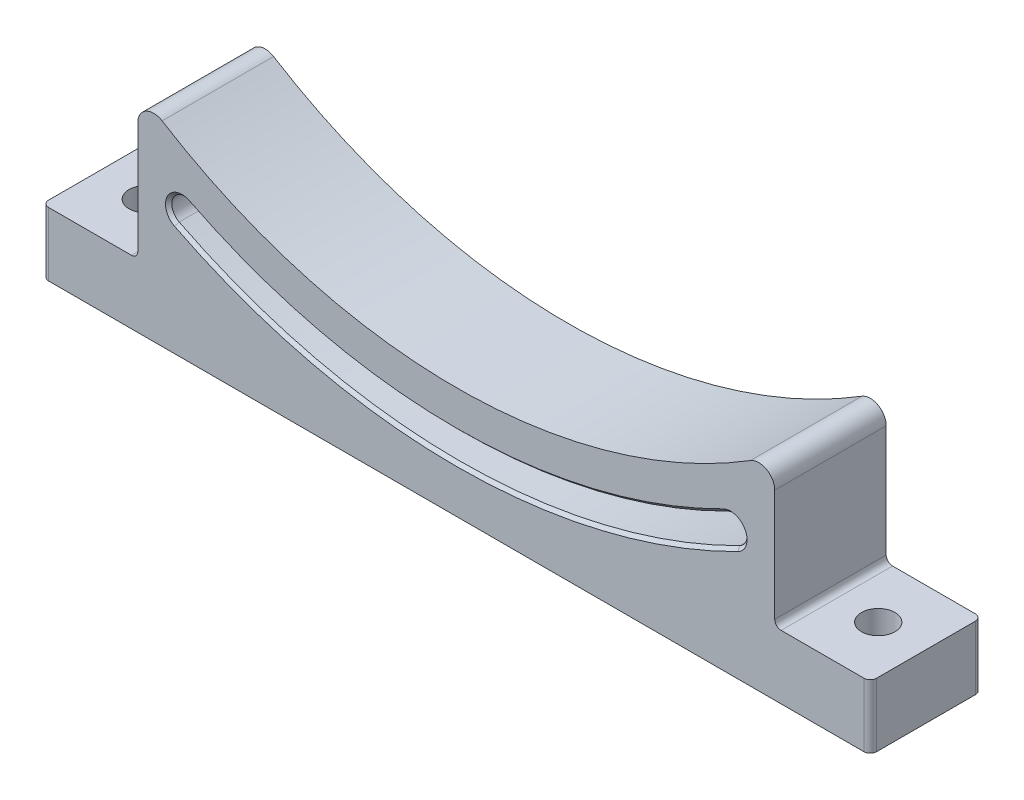
ISO-10303-21;
HEADER;
FILE_DESCRIPTION(('STEP AP214'),'2;1');
FILE_NAME('part.step','',(''),(''),'','','');
FILE_SCHEMA(('AUTOMOTIVE_DESIGN { 1 0 10303 214 1 1 1 1 }'));
ENDSEC;
DATA;
#1=APPLICATION_CONTEXT('core data for automotive mechanical design processes');
#2=APPLICATION_PROTOCOL_DEFINITION('international standard','automotive_design',2000,#1);
#3=PRODUCT_CONTEXT('',#1,'mechanical');
#4=PRODUCT('Part','Part','',(#3));
#5=PRODUCT_RELATED_PRODUCT_CATEGORY('part','',(#4));
#6=PRODUCT_DEFINITION_FORMATION('','',#4);
#7=PRODUCT_DEFINITION_CONTEXT('part definition',#1,'design');
#8=PRODUCT_DEFINITION('design','',#6,#7);
#9=PRODUCT_DEFINITION_SHAPE('','',#8);
#10=(LENGTH_UNIT() NAMED_UNIT(*) SI_UNIT(.MILLI.,.METRE.));
#11=(NAMED_UNIT(*) PLANE_ANGLE_UNIT() SI_UNIT($,.RADIAN.));
#12=(NAMED_UNIT(*) SI_UNIT($,.STERADIAN.) SOLID_ANGLE_UNIT());
#13=UNCERTAINTY_MEASURE_WITH_UNIT(LENGTH_MEASURE(1.E-05),#10,'distance_accuracy_value','');
#14=(GEOMETRIC_REPRESENTATION_CONTEXT(3) GLOBAL_UNCERTAINTY_ASSIGNED_CONTEXT((#13)) GLOBAL_UNIT_ASSIGNED_CONTEXT((#10,
#11,#12)) REPRESENTATION_CONTEXT('',''));
#15=CARTESIAN_POINT('',(0.,0.,0.));
#16=DIRECTION('',(0.,0.,1.));
#17=DIRECTION('',(1.,0.,0.));
#18=AXIS2_PLACEMENT_3D('',#15,#16,#17);
#19=CARTESIAN_POINT('',(-200.,0.,35.));
#20=DIRECTION('',(1.,0.,0.));
#21=DIRECTION('',(0.,0.,-1.));
#22=AXIS2_PLACEMENT_3D('',#19,#20,#21);
#23=PLANE('',#22);
#24=DIRECTION('',(0.,-1.,0.));
#25=VECTOR('',#24,1.);
#26=CARTESIAN_POINT('',(-200.,0.,0.));
#27=LINE('',#26,#25);
#28=CARTESIAN_POINT('',(-200.,57.1111514857934,0.));
#29=VERTEX_POINT('',#28);
#30=CARTESIAN_POINT('',(-200.,22.,0.));
#31=VERTEX_POINT('',#30);
#32=EDGE_CURVE('E227',#29,#31,#27,.T.);
#33=ORIENTED_EDGE('',*,*,#32,.T.);
#34=DIRECTION('',(0.,0.,-1.));
#35=VECTOR('',#34,1.);
#36=CARTESIAN_POINT('',(-200.,22.,35.));
#37=LINE('',#36,#35);
#38=CARTESIAN_POINT('',(-200.,22.,35.));
#39=VERTEX_POINT('',#38);
#40=EDGE_CURVE('E322',#31,#39,#37,.F.);
#41=ORIENTED_EDGE('',*,*,#40,.T.);
#42=DIRECTION('',(0.,-1.,0.));
#43=VECTOR('',#42,1.);
#44=CARTESIAN_POINT('',(-200.,0.,35.));
#45=LINE('',#44,#43);
#46=CARTESIAN_POINT('',(-200.,57.1111514857934,35.));
#47=VERTEX_POINT('',#46);
#48=EDGE_CURVE('E399',#47,#39,#45,.T.);
#49=ORIENTED_EDGE('',*,*,#48,.F.);
#50=DIRECTION('',(0.,0.,-1.));
#51=VECTOR('',#50,1.);
#52=CARTESIAN_POINT('',(-200.,57.1111514857934,35.));
#53=LINE('',#52,#51);
#54=EDGE_CURVE('E248',#47,#29,#53,.T.);
#55=ORIENTED_EDGE('',*,*,#54,.T.);
#56=EDGE_LOOP('',(#33,#41,#49,#55));
#57=FACE_BOUND('',#56,.T.);
#58=ADVANCED_FACE('F40',(#57),#23,.F.);
#59=CARTESIAN_POINT('',(0.,0.,35.));
#60=DIRECTION('',(-1.,0.,0.));
#61=DIRECTION('',(0.,0.,1.));
#62=AXIS2_PLACEMENT_3D('',#59,#60,#61);
#63=PLANE('',#62);
#64=DIRECTION('',(0.,1.,0.));
#65=VECTOR('',#64,1.);
#66=CARTESIAN_POINT('',(0.,0.,35.));
#67=LINE('',#66,#65);
#68=CARTESIAN_POINT('',(0.,22.,35.));
#69=VERTEX_POINT('',#68);
#70=CARTESIAN_POINT('',(0.,57.1111514857934,35.));
#71=VERTEX_POINT('',#70);
#72=EDGE_CURVE('E239',#69,#71,#67,.T.);
#73=ORIENTED_EDGE('',*,*,#72,.F.);
#74=DIRECTION('',(0.,0.,1.));
#75=VECTOR('',#74,1.);
#76=CARTESIAN_POINT('',(0.,22.,0.));
#77=LINE('',#76,#75);
#78=CARTESIAN_POINT('',(0.,22.,0.));
#79=VERTEX_POINT('',#78);
#80=EDGE_CURVE('E312',#69,#79,#77,.F.);
#81=ORIENTED_EDGE('',*,*,#80,.T.);
#82=DIRECTION('',(0.,1.,0.));
#83=VECTOR('',#82,1.);
#84=CARTESIAN_POINT('',(0.,0.,0.));
#85=LINE('',#84,#83);
#86=CARTESIAN_POINT('',(0.,57.1111514857934,0.));
#87=VERTEX_POINT('',#86);
#88=EDGE_CURVE('E228',#79,#87,#85,.T.);
#89=ORIENTED_EDGE('',*,*,#88,.T.);
#90=DIRECTION('',(0.,0.,-1.));
#91=VECTOR('',#90,1.);
#92=CARTESIAN_POINT('',(0.,57.1111514857934,35.));
#93=LINE('',#92,#91);
#94=EDGE_CURVE('E208',#87,#71,#93,.F.);
#95=ORIENTED_EDGE('',*,*,#94,.T.);
#96=EDGE_LOOP('',(#73,#81,#89,#95));
#97=FACE_BOUND('',#96,.T.);
#98=ADVANCED_FACE('F432',(#97),#63,.F.);
#99=CARTESIAN_POINT('',(-100.,210.,35.));
#100=DIRECTION('',(0.,0.,1.));
#101=DIRECTION('',(1.,0.,0.));
#102=AXIS2_PLACEMENT_3D('',#99,#100,#101);
#103=PLANE('',#102);
#104=CARTESIAN_POINT('',(-13.8915046059366,39.2874725716635,35.));
#105=DIRECTION('',(0.,0.,1.));
#106=DIRECTION('',(1.,0.,0.));
#107=AXIS2_PLACEMENT_3D('',#104,#105,#106);
#108=CIRCLE('',#107,5.20000000000003);
#109=CARTESIAN_POINT('',(-16.2333674513817,43.9302818950283,35.));
#110=VERTEX_POINT('',#109);
#111=CARTESIAN_POINT('',(-11.5496417604913,34.6446632482986,35.));
#112=VERTEX_POINT('',#111);
#113=EDGE_CURVE('E261',#110,#112,#108,.F.);
#114=ORIENTED_EDGE('',*,*,#113,.T.);
#115=CARTESIAN_POINT('',(-100.,210.,35.));
#116=DIRECTION('',(0.,0.,1.));
#117=DIRECTION('',(1.,0.,0.));
#118=AXIS2_PLACEMENT_3D('',#115,#116,#117);
#119=CIRCLE('',#118,196.4);
#120=CARTESIAN_POINT('',(-188.450358239509,34.6446632482987,35.));
#121=VERTEX_POINT('',#120);
#122=EDGE_CURVE('E263',#112,#121,#119,.F.);
#123=ORIENTED_EDGE('',*,*,#122,.T.);
#124=CARTESIAN_POINT('',(-186.108495394063,39.2874725716635,35.));
#125=DIRECTION('',(0.,0.,1.));
#126=DIRECTION('',(1.,0.,0.));
#127=AXIS2_PLACEMENT_3D('',#124,#125,#126);
#128=CIRCLE('',#127,5.20000000000003);
#129=CARTESIAN_POINT('',(-183.766632548618,43.9302818950283,35.));
#130=VERTEX_POINT('',#129);
#131=EDGE_CURVE('E259',#121,#130,#128,.F.);
#132=ORIENTED_EDGE('',*,*,#131,.T.);
#133=CARTESIAN_POINT('',(-100.,210.,35.));
#134=DIRECTION('',(0.,0.,1.));
#135=DIRECTION('',(1.,0.,0.));
#136=AXIS2_PLACEMENT_3D('',#133,#134,#135);
#137=CIRCLE('',#136,186.);
#138=EDGE_CURVE('E257',#130,#110,#137,.T.);
#139=ORIENTED_EDGE('',*,*,#138,.T.);
#140=EDGE_LOOP('',(#114,#123,#132,#139));
#141=FACE_BOUND('',#140,.T.);
#142=DIRECTION('',(1.,0.,0.));
#143=VECTOR('',#142,1.);
#144=CARTESIAN_POINT('',(0.,0.,35.));
#145=LINE('',#144,#143);
#146=CARTESIAN_POINT('',(-228.,0.,35.));
#147=VERTEX_POINT('',#146);
#148=CARTESIAN_POINT('',(28.,0.,35.));
#149=VERTEX_POINT('',#148);
#150=EDGE_CURVE('E240',#147,#149,#145,.T.);
#151=ORIENTED_EDGE('',*,*,#150,.T.);
#152=DIRECTION('',(0.,-1.,0.));
#153=VECTOR('',#152,1.);
#154=CARTESIAN_POINT('',(28.,210.,35.));
#155=LINE('',#154,#153);
#156=CARTESIAN_POINT('',(28.,20.,35.));
#157=VERTEX_POINT('',#156);
#158=EDGE_CURVE('E345',#149,#157,#155,.F.);
#159=ORIENTED_EDGE('',*,*,#158,.T.);
#160=DIRECTION('',(-1.,0.,0.));
#161=VECTOR('',#160,1.);
#162=CARTESIAN_POINT('',(30.,20.,35.));
#163=LINE('',#162,#161);
#164=CARTESIAN_POINT('',(2.,20.,35.));
#165=VERTEX_POINT('',#164);
#166=EDGE_CURVE('E384',#157,#165,#163,.T.);
#167=ORIENTED_EDGE('',*,*,#166,.T.);
#168=CARTESIAN_POINT('',(2.,22.,35.));
#169=DIRECTION('',(0.,0.,1.));
#170=DIRECTION('',(1.,0.,0.));
#171=AXIS2_PLACEMENT_3D('',#168,#169,#170);
#172=CIRCLE('',#171,2.);
#173=EDGE_CURVE('E314',#165,#69,#172,.F.);
#174=ORIENTED_EDGE('',*,*,#173,.T.);
#175=ORIENTED_EDGE('',*,*,#72,.T.);
#176=CARTESIAN_POINT('',(-5.,57.1111514857934,35.));
#177=DIRECTION('',(0.,0.,1.));
#178=DIRECTION('',(1.,0.,0.));
#179=AXIS2_PLACEMENT_3D('',#176,#177,#178);
#180=CIRCLE('',#179,5.);
#181=CARTESIAN_POINT('',(-7.63888888888889,61.3580639445214,35.));
#182=VERTEX_POINT('',#181);
#183=EDGE_CURVE('E246',#71,#182,#180,.T.);
#184=ORIENTED_EDGE('',*,*,#183,.T.);
#185=CARTESIAN_POINT('',(-100.,210.,35.));
#186=DIRECTION('',(0.,0.,-1.));
#187=DIRECTION('',(1.,0.,0.));
#188=AXIS2_PLACEMENT_3D('',#185,#186,#187);
#189=CIRCLE('',#188,175.);
#190=CARTESIAN_POINT('',(-192.361111111111,61.3580639445214,35.));
#191=VERTEX_POINT('',#190);
#192=EDGE_CURVE('E221',#182,#191,#189,.T.);
#193=ORIENTED_EDGE('',*,*,#192,.T.);
#194=CARTESIAN_POINT('',(-195.,57.1111514857934,35.));
#195=DIRECTION('',(0.,0.,1.));
#196=DIRECTION('',(1.,0.,0.));
#197=AXIS2_PLACEMENT_3D('',#194,#195,#196);
#198=CIRCLE('',#197,5.);
#199=EDGE_CURVE('E244',#191,#47,#198,.T.);
#200=ORIENTED_EDGE('',*,*,#199,.T.);
#201=ORIENTED_EDGE('',*,*,#48,.T.);
#202=CARTESIAN_POINT('',(-202.,22.,35.));
#203=DIRECTION('',(0.,0.,1.));
#204=DIRECTION('',(1.,0.,0.));
#205=AXIS2_PLACEMENT_3D('',#202,#203,#204);
#206=CIRCLE('',#205,2.);
#207=CARTESIAN_POINT('',(-202.,20.,35.));
#208=VERTEX_POINT('',#207);
#209=EDGE_CURVE('E326',#39,#208,#206,.F.);
#210=ORIENTED_EDGE('',*,*,#209,.T.);
#211=DIRECTION('',(1.,0.,0.));
#212=VECTOR('',#211,1.);
#213=CARTESIAN_POINT('',(-230.,20.,35.));
#214=LINE('',#213,#212);
#215=CARTESIAN_POINT('',(-228.,20.,35.));
#216=VERTEX_POINT('',#215);
#217=EDGE_CURVE('E371',#216,#208,#214,.T.);
#218=ORIENTED_EDGE('',*,*,#217,.F.);
#219=DIRECTION('',(0.,1.,0.));
#220=VECTOR('',#219,1.);
#221=CARTESIAN_POINT('',(-228.,210.,35.));
#222=LINE('',#221,#220);
#223=EDGE_CURVE('E343',#216,#147,#222,.F.);
#224=ORIENTED_EDGE('',*,*,#223,.T.);
#225=EDGE_LOOP('',(#151,#159,#167,#174,#175,#184,#193,#200,#201,#210,#218,#224));
#226=FACE_BOUND('',#225,.T.);
#227=ADVANCED_FACE('F405',(#141,#226),#103,.T.);
#228=CARTESIAN_POINT('',(-100.,210.,0.));
#229=DIRECTION('',(0.,0.,1.));
#230=DIRECTION('',(1.,0.,0.));
#231=AXIS2_PLACEMENT_3D('',#228,#229,#230);
#232=PLANE('',#231);
#233=CARTESIAN_POINT('',(-186.108495394063,39.2874725716635,0.));
#234=DIRECTION('',(0.,0.,1.));
#235=DIRECTION('',(1.,0.,0.));
#236=AXIS2_PLACEMENT_3D('',#233,#234,#235);
#237=CIRCLE('',#236,5.19999999999991);
#238=CARTESIAN_POINT('',(-183.766632548618,43.9302818950282,0.));
#239=VERTEX_POINT('',#238);
#240=CARTESIAN_POINT('',(-188.450358239509,34.6446632482988,0.));
#241=VERTEX_POINT('',#240);
#242=EDGE_CURVE('E280',#239,#241,#237,.T.);
#243=ORIENTED_EDGE('',*,*,#242,.T.);
#244=CARTESIAN_POINT('',(-100.,210.,0.));
#245=DIRECTION('',(0.,0.,1.));
#246=DIRECTION('',(1.,0.,0.));
#247=AXIS2_PLACEMENT_3D('',#244,#245,#246);
#248=CIRCLE('',#247,196.4);
#249=CARTESIAN_POINT('',(-11.5496417604914,34.6446632482987,0.));
#250=VERTEX_POINT('',#249);
#251=EDGE_CURVE('E284',#241,#250,#248,.T.);
#252=ORIENTED_EDGE('',*,*,#251,.T.);
#253=CARTESIAN_POINT('',(-13.8915046059366,39.2874725716635,0.));
#254=DIRECTION('',(0.,0.,1.));
#255=DIRECTION('',(1.,0.,0.));
#256=AXIS2_PLACEMENT_3D('',#253,#254,#255);
#257=CIRCLE('',#256,5.19999999999991);
#258=CARTESIAN_POINT('',(-16.2333674513817,43.9302818950282,0.));
#259=VERTEX_POINT('',#258);
#260=EDGE_CURVE('E282',#250,#259,#257,.T.);
#261=ORIENTED_EDGE('',*,*,#260,.T.);
#262=CARTESIAN_POINT('',(-100.,210.,0.));
#263=DIRECTION('',(0.,0.,1.));
#264=DIRECTION('',(1.,0.,0.));
#265=AXIS2_PLACEMENT_3D('',#262,#263,#264);
#266=CIRCLE('',#265,186.);
#267=EDGE_CURVE('E278',#259,#239,#266,.F.);
#268=ORIENTED_EDGE('',*,*,#267,.T.);
#269=EDGE_LOOP('',(#243,#252,#261,#268));
#270=FACE_BOUND('',#269,.T.);
#271=DIRECTION('',(-1.,0.,0.));
#272=VECTOR('',#271,1.);
#273=CARTESIAN_POINT('',(30.,20.,0.));
#274=LINE('',#273,#272);
#275=CARTESIAN_POINT('',(28.,20.,0.));
#276=VERTEX_POINT('',#275);
#277=CARTESIAN_POINT('',(2.,20.,0.));
#278=VERTEX_POINT('',#277);
#279=EDGE_CURVE('E303',#276,#278,#274,.T.);
#280=ORIENTED_EDGE('',*,*,#279,.F.);
#281=DIRECTION('',(0.,1.,0.));
#282=VECTOR('',#281,1.);
#283=CARTESIAN_POINT('',(28.,0.,0.));
#284=LINE('',#283,#282);
#285=CARTESIAN_POINT('',(28.,0.,0.));
#286=VERTEX_POINT('',#285);
#287=EDGE_CURVE('E353',#276,#286,#284,.F.);
#288=ORIENTED_EDGE('',*,*,#287,.T.);
#289=DIRECTION('',(1.,0.,0.));
#290=VECTOR('',#289,1.);
#291=CARTESIAN_POINT('',(0.,0.,0.));
#292=LINE('',#291,#290);
#293=CARTESIAN_POINT('',(-228.,0.,0.));
#294=VERTEX_POINT('',#293);
#295=EDGE_CURVE('E231',#294,#286,#292,.T.);
#296=ORIENTED_EDGE('',*,*,#295,.F.);
#297=DIRECTION('',(0.,-1.,0.));
#298=VECTOR('',#297,1.);
#299=CARTESIAN_POINT('',(-228.,20.,0.));
#300=LINE('',#299,#298);
#301=CARTESIAN_POINT('',(-228.,20.,0.));
#302=VERTEX_POINT('',#301);
#303=EDGE_CURVE('E351',#294,#302,#300,.F.);
#304=ORIENTED_EDGE('',*,*,#303,.T.);
#305=DIRECTION('',(1.,0.,0.));
#306=VECTOR('',#305,1.);
#307=CARTESIAN_POINT('',(-230.,20.,0.));
#308=LINE('',#307,#306);
#309=CARTESIAN_POINT('',(-202.,20.,0.));
#310=VERTEX_POINT('',#309);
#311=EDGE_CURVE('E369',#302,#310,#308,.T.);
#312=ORIENTED_EDGE('',*,*,#311,.T.);
#313=CARTESIAN_POINT('',(-202.,22.,0.));
#314=DIRECTION('',(0.,0.,1.));
#315=DIRECTION('',(1.,0.,0.));
#316=AXIS2_PLACEMENT_3D('',#313,#314,#315);
#317=CIRCLE('',#316,2.);
#318=EDGE_CURVE('E324',#310,#31,#317,.T.);
#319=ORIENTED_EDGE('',*,*,#318,.T.);
#320=ORIENTED_EDGE('',*,*,#32,.F.);
#321=CARTESIAN_POINT('',(-195.,57.1111514857934,0.));
#322=DIRECTION('',(0.,0.,1.));
#323=DIRECTION('',(1.,0.,0.));
#324=AXIS2_PLACEMENT_3D('',#321,#322,#323);
#325=CIRCLE('',#324,5.);
#326=CARTESIAN_POINT('',(-192.361111111111,61.3580639445214,0.));
#327=VERTEX_POINT('',#326);
#328=EDGE_CURVE('E212',#29,#327,#325,.F.);
#329=ORIENTED_EDGE('',*,*,#328,.T.);
#330=CARTESIAN_POINT('',(-100.,210.,0.));
#331=DIRECTION('',(0.,0.,-1.));
#332=DIRECTION('',(1.,0.,0.));
#333=AXIS2_PLACEMENT_3D('',#330,#331,#332);
#334=CIRCLE('',#333,175.);
#335=CARTESIAN_POINT('',(-7.63888888888889,61.3580639445214,0.));
#336=VERTEX_POINT('',#335);
#337=EDGE_CURVE('E218',#336,#327,#334,.T.);
#338=ORIENTED_EDGE('',*,*,#337,.F.);
#339=CARTESIAN_POINT('',(-5.,57.1111514857934,0.));
#340=DIRECTION('',(0.,0.,1.));
#341=DIRECTION('',(1.,0.,0.));
#342=AXIS2_PLACEMENT_3D('',#339,#340,#341);
#343=CIRCLE('',#342,5.);
#344=EDGE_CURVE('E202',#336,#87,#343,.F.);
#345=ORIENTED_EDGE('',*,*,#344,.T.);
#346=ORIENTED_EDGE('',*,*,#88,.F.);
#347=CARTESIAN_POINT('',(2.,22.,0.));
#348=DIRECTION('',(0.,0.,1.));
#349=DIRECTION('',(1.,0.,0.));
#350=AXIS2_PLACEMENT_3D('',#347,#348,#349);
#351=CIRCLE('',#350,2.);
#352=EDGE_CURVE('E316',#79,#278,#351,.T.);
#353=ORIENTED_EDGE('',*,*,#352,.T.);
#354=EDGE_LOOP('',(#280,#288,#296,#304,#312,#319,#320,#329,#338,#345,#346,#353));
#355=FACE_BOUND('',#354,.T.);
#356=ADVANCED_FACE('F225',(#270,#355),#232,.F.);
#357=CARTESIAN_POINT('',(-100.,210.,35.));
#358=DIRECTION('',(0.,0.,-1.));
#359=DIRECTION('',(-1.,0.,0.));
#360=AXIS2_PLACEMENT_3D('',#357,#358,#359);
#361=CYLINDRICAL_SURFACE('',#360,175.);
#362=ORIENTED_EDGE('',*,*,#192,.F.);
#363=DIRECTION('',(0.,0.,-1.));
#364=VECTOR('',#363,1.);
#365=CARTESIAN_POINT('',(-7.63888888888889,61.3580639445214,35.));
#366=LINE('',#365,#364);
#367=EDGE_CURVE('E206',#182,#336,#366,.T.);
#368=ORIENTED_EDGE('',*,*,#367,.T.);
#369=ORIENTED_EDGE('',*,*,#337,.T.);
#370=DIRECTION('',(0.,0.,-1.));
#371=VECTOR('',#370,1.);
#372=CARTESIAN_POINT('',(-192.361111111111,61.3580639445214,35.));
#373=LINE('',#372,#371);
#374=EDGE_CURVE('E222',#327,#191,#373,.F.);
#375=ORIENTED_EDGE('',*,*,#374,.T.);
#376=EDGE_LOOP('',(#362,#368,#369,#375));
#377=FACE_BOUND('',#376,.T.);
#378=ADVANCED_FACE('F217',(#377),#361,.F.);
#379=CARTESIAN_POINT('',(0.,0.,35.));
#380=DIRECTION('',(0.,1.,0.));
#381=DIRECTION('',(0.,0.,1.));
#382=AXIS2_PLACEMENT_3D('',#379,#380,#381);
#383=PLANE('',#382);
#384=CARTESIAN_POINT('',(-215.,0.,17.5));
#385=DIRECTION('',(0.,1.,0.));
#386=DIRECTION('',(0.,0.,1.));
#387=AXIS2_PLACEMENT_3D('',#384,#385,#386);
#388=CIRCLE('',#387,5.25);
#389=CARTESIAN_POINT('',(-215.,0.,22.75));
#390=VERTEX_POINT('',#389);
#391=EDGE_CURVE('E373',#390,#390,#388,.F.);
#392=ORIENTED_EDGE('',*,*,#391,.F.);
#393=EDGE_LOOP('',(#392));
#394=FACE_BOUND('',#393,.T.);
#395=CARTESIAN_POINT('',(15.,0.,17.5));
#396=DIRECTION('',(0.,1.,0.));
#397=DIRECTION('',(0.,0.,1.));
#398=AXIS2_PLACEMENT_3D('',#395,#396,#397);
#399=CIRCLE('',#398,5.25);
#400=CARTESIAN_POINT('',(15.,0.,22.75));
#401=VERTEX_POINT('',#400);
#402=EDGE_CURVE('E873',#401,#401,#399,.F.);
#403=ORIENTED_EDGE('',*,*,#402,.F.);
#404=EDGE_LOOP('',(#403));
#405=FACE_BOUND('',#404,.T.);
#406=DIRECTION('',(0.,0.,-1.));
#407=VECTOR('',#406,1.);
#408=CARTESIAN_POINT('',(30.,0.,35.));
#409=LINE('',#408,#407);
#410=CARTESIAN_POINT('',(30.,0.,33.));
#411=VERTEX_POINT('',#410);
#412=CARTESIAN_POINT('',(30.,0.,2.));
#413=VERTEX_POINT('',#412);
#414=EDGE_CURVE('E378',#411,#413,#409,.T.);
#415=ORIENTED_EDGE('',*,*,#414,.F.);
#416=CARTESIAN_POINT('',(28.,0.,33.));
#417=DIRECTION('',(0.,1.,0.));
#418=DIRECTION('',(0.,0.,1.));
#419=AXIS2_PLACEMENT_3D('',#416,#417,#418);
#420=CIRCLE('',#419,2.);
#421=EDGE_CURVE('E341',#411,#149,#420,.F.);
#422=ORIENTED_EDGE('',*,*,#421,.T.);
#423=ORIENTED_EDGE('',*,*,#150,.F.);
#424=CARTESIAN_POINT('',(-228.,0.,33.));
#425=DIRECTION('',(0.,1.,0.));
#426=DIRECTION('',(0.,0.,1.));
#427=AXIS2_PLACEMENT_3D('',#424,#425,#426);
#428=CIRCLE('',#427,2.);
#429=CARTESIAN_POINT('',(-230.,0.,33.));
#430=VERTEX_POINT('',#429);
#431=EDGE_CURVE('E337',#147,#430,#428,.F.);
#432=ORIENTED_EDGE('',*,*,#431,.T.);
#433=DIRECTION('',(0.,0.,1.));
#434=VECTOR('',#433,1.);
#435=CARTESIAN_POINT('',(-230.,0.,0.));
#436=LINE('',#435,#434);
#437=CARTESIAN_POINT('',(-230.,0.,2.));
#438=VERTEX_POINT('',#437);
#439=EDGE_CURVE('E365',#438,#430,#436,.T.);
#440=ORIENTED_EDGE('',*,*,#439,.F.);
#441=CARTESIAN_POINT('',(-228.,0.,2.));
#442=DIRECTION('',(0.,1.,0.));
#443=DIRECTION('',(0.,0.,1.));
#444=AXIS2_PLACEMENT_3D('',#441,#442,#443);
#445=CIRCLE('',#444,2.);
#446=EDGE_CURVE('E335',#438,#294,#445,.F.);
#447=ORIENTED_EDGE('',*,*,#446,.T.);
#448=ORIENTED_EDGE('',*,*,#295,.T.);
#449=CARTESIAN_POINT('',(28.,0.,2.));
#450=DIRECTION('',(0.,1.,0.));
#451=DIRECTION('',(0.,0.,1.));
#452=AXIS2_PLACEMENT_3D('',#449,#450,#451);
#453=CIRCLE('',#452,2.);
#454=EDGE_CURVE('E339',#286,#413,#453,.F.);
#455=ORIENTED_EDGE('',*,*,#454,.T.);
#456=EDGE_LOOP('',(#415,#422,#423,#432,#440,#447,#448,#455));
#457=FACE_BOUND('',#456,.T.);
#458=ADVANCED_FACE('F446',(#394,#405,#457),#383,.F.);
#459=CARTESIAN_POINT('',(-186.108495394063,39.2874725716635,35.));
#460=DIRECTION('',(0.,0.,-1.));
#461=DIRECTION('',(-1.,0.,0.));
#462=AXIS2_PLACEMENT_3D('',#459,#460,#461);
#463=CYLINDRICAL_SURFACE('',#462,4.2);
#464=DIRECTION('',(0.,0.,-1.));
#465=VECTOR('',#464,1.);
#466=CARTESIAN_POINT('',(-184.216990788127,43.0374339482273,35.));
#467=LINE('',#466,#465);
#468=CARTESIAN_POINT('',(-184.216990788127,43.0374339482273,34.));
#469=VERTEX_POINT('',#468);
#470=CARTESIAN_POINT('',(-184.216990788127,43.0374339482273,0.999999999999945));
#471=VERTEX_POINT('',#470);
#472=EDGE_CURVE('E299',#469,#471,#467,.T.);
#473=ORIENTED_EDGE('',*,*,#472,.F.);
#474=CARTESIAN_POINT('',(-186.108495394063,39.2874725716635,34.));
#475=DIRECTION('',(0.,0.,1.));
#476=DIRECTION('',(1.,0.,0.));
#477=AXIS2_PLACEMENT_3D('',#474,#475,#476);
#478=CIRCLE('',#477,4.2);
#479=CARTESIAN_POINT('',(-188.,35.5375111950996,34.));
#480=VERTEX_POINT('',#479);
#481=EDGE_CURVE('E272',#469,#480,#478,.T.);
#482=ORIENTED_EDGE('',*,*,#481,.T.);
#483=DIRECTION('',(0.,0.,-1.));
#484=VECTOR('',#483,1.);
#485=CARTESIAN_POINT('',(-188.,35.5375111950996,35.));
#486=LINE('',#485,#484);
#487=CARTESIAN_POINT('',(-188.,35.5375111950996,0.999999999999945));
#488=VERTEX_POINT('',#487);
#489=EDGE_CURVE('E233',#480,#488,#486,.T.);
#490=ORIENTED_EDGE('',*,*,#489,.T.);
#491=CARTESIAN_POINT('',(-186.108495394063,39.2874725716635,0.999999999999945));
#492=DIRECTION('',(0.,0.,1.));
#493=DIRECTION('',(1.,0.,0.));
#494=AXIS2_PLACEMENT_3D('',#491,#492,#493);
#495=CIRCLE('',#494,4.2);
#496=EDGE_CURVE('E270',#488,#471,#495,.F.);
#497=ORIENTED_EDGE('',*,*,#496,.T.);
#498=EDGE_LOOP('',(#473,#482,#490,#497));
#499=FACE_BOUND('',#498,.T.);
#500=ADVANCED_FACE('F561',(#499),#463,.F.);
#501=CARTESIAN_POINT('',(-100.,210.,35.));
#502=DIRECTION('',(0.,0.,-1.));
#503=DIRECTION('',(-1.,0.,0.));
#504=AXIS2_PLACEMENT_3D('',#501,#502,#503);
#505=CYLINDRICAL_SURFACE('',#504,195.4);
#506=ORIENTED_EDGE('',*,*,#489,.F.);
#507=CARTESIAN_POINT('',(-100.,210.,34.));
#508=DIRECTION('',(0.,0.,1.));
#509=DIRECTION('',(1.,0.,0.));
#510=AXIS2_PLACEMENT_3D('',#507,#508,#509);
#511=CIRCLE('',#510,195.4);
#512=CARTESIAN_POINT('',(-12.,35.5375111950996,34.));
#513=VERTEX_POINT('',#512);
#514=EDGE_CURVE('E254',#480,#513,#511,.T.);
#515=ORIENTED_EDGE('',*,*,#514,.T.);
#516=DIRECTION('',(0.,0.,-1.));
#517=VECTOR('',#516,1.);
#518=CARTESIAN_POINT('',(-12.,35.5375111950996,35.));
#519=LINE('',#518,#517);
#520=CARTESIAN_POINT('',(-12.,35.5375111950996,0.999999999999945));
#521=VERTEX_POINT('',#520);
#522=EDGE_CURVE('E392',#513,#521,#519,.T.);
#523=ORIENTED_EDGE('',*,*,#522,.T.);
#524=CARTESIAN_POINT('',(-100.,210.,1.00000000000003));
#525=DIRECTION('',(0.,0.,1.));
#526=DIRECTION('',(1.,0.,0.));
#527=AXIS2_PLACEMENT_3D('',#524,#525,#526);
#528=CIRCLE('',#527,195.4);
#529=EDGE_CURVE('E251',#521,#488,#528,.F.);
#530=ORIENTED_EDGE('',*,*,#529,.T.);
#531=EDGE_LOOP('',(#506,#515,#523,#530));
#532=FACE_BOUND('',#531,.T.);
#533=ADVANCED_FACE('F737',(#532),#505,.F.);
#534=CARTESIAN_POINT('',(-13.8915046059366,39.2874725716635,35.));
#535=DIRECTION('',(0.,0.,-1.));
#536=DIRECTION('',(-1.,0.,0.));
#537=AXIS2_PLACEMENT_3D('',#534,#535,#536);
#538=CYLINDRICAL_SURFACE('',#537,4.2);
#539=ORIENTED_EDGE('',*,*,#522,.F.);
#540=CARTESIAN_POINT('',(-13.8915046059366,39.2874725716635,34.));
#541=DIRECTION('',(0.,0.,1.));
#542=DIRECTION('',(1.,0.,0.));
#543=AXIS2_PLACEMENT_3D('',#540,#541,#542);
#544=CIRCLE('',#543,4.2);
#545=CARTESIAN_POINT('',(-15.783009211873,43.0374339482273,34.));
#546=VERTEX_POINT('',#545);
#547=EDGE_CURVE('E268',#513,#546,#544,.T.);
#548=ORIENTED_EDGE('',*,*,#547,.T.);
#549=DIRECTION('',(0.,0.,-1.));
#550=VECTOR('',#549,1.);
#551=CARTESIAN_POINT('',(-15.783009211873,43.0374339482273,35.));
#552=LINE('',#551,#550);
#553=CARTESIAN_POINT('',(-15.783009211873,43.0374339482273,0.999999999999945));
#554=VERTEX_POINT('',#553);
#555=EDGE_CURVE('E389',#546,#554,#552,.T.);
#556=ORIENTED_EDGE('',*,*,#555,.T.);
#557=CARTESIAN_POINT('',(-13.8915046059366,39.2874725716635,0.999999999999945));
#558=DIRECTION('',(0.,0.,1.));
#559=DIRECTION('',(1.,0.,0.));
#560=AXIS2_PLACEMENT_3D('',#557,#558,#559);
#561=CIRCLE('',#560,4.2);
#562=EDGE_CURVE('E266',#554,#521,#561,.F.);
#563=ORIENTED_EDGE('',*,*,#562,.T.);
#564=EDGE_LOOP('',(#539,#548,#556,#563));
#565=FACE_BOUND('',#564,.T.);
#566=ADVANCED_FACE('F727',(#565),#538,.F.);
#567=CARTESIAN_POINT('',(-100.,210.,35.));
#568=DIRECTION('',(0.,0.,-1.));
#569=DIRECTION('',(-1.,0.,0.));
#570=AXIS2_PLACEMENT_3D('',#567,#568,#569);
#571=CYLINDRICAL_SURFACE('',#570,187.);
#572=ORIENTED_EDGE('',*,*,#555,.F.);
#573=CARTESIAN_POINT('',(-100.,210.,34.));
#574=DIRECTION('',(0.,0.,1.));
#575=DIRECTION('',(1.,0.,0.));
#576=AXIS2_PLACEMENT_3D('',#573,#574,#575);
#577=CIRCLE('',#576,187.);
#578=EDGE_CURVE('E276',#546,#469,#577,.F.);
#579=ORIENTED_EDGE('',*,*,#578,.T.);
#580=ORIENTED_EDGE('',*,*,#472,.T.);
#581=CARTESIAN_POINT('',(-100.,210.,0.999999999999945));
#582=DIRECTION('',(0.,0.,1.));
#583=DIRECTION('',(1.,0.,0.));
#584=AXIS2_PLACEMENT_3D('',#581,#582,#583);
#585=CIRCLE('',#584,187.);
#586=EDGE_CURVE('E274',#471,#554,#585,.T.);
#587=ORIENTED_EDGE('',*,*,#586,.T.);
#588=EDGE_LOOP('',(#572,#579,#580,#587));
#589=FACE_BOUND('',#588,.T.);
#590=ADVANCED_FACE('F471',(#589),#571,.T.);
#591=CARTESIAN_POINT('',(-5.,57.1111514857934,35.));
#592=DIRECTION('',(0.,0.,-1.));
#593=DIRECTION('',(-1.,0.,0.));
#594=AXIS2_PLACEMENT_3D('',#591,#592,#593);
#595=CYLINDRICAL_SURFACE('',#594,5.);
#596=ORIENTED_EDGE('',*,*,#183,.F.);
#597=ORIENTED_EDGE('',*,*,#94,.F.);
#598=ORIENTED_EDGE('',*,*,#344,.F.);
#599=ORIENTED_EDGE('',*,*,#367,.F.);
#600=EDGE_LOOP('',(#596,#597,#598,#599));
#601=FACE_BOUND('',#600,.T.);
#602=ADVANCED_FACE('F205',(#601),#595,.T.);
#603=CARTESIAN_POINT('',(-195.,57.1111514857934,35.));
#604=DIRECTION('',(0.,0.,-1.));
#605=DIRECTION('',(-1.,0.,0.));
#606=AXIS2_PLACEMENT_3D('',#603,#604,#605);
#607=CYLINDRICAL_SURFACE('',#606,5.);
#608=ORIENTED_EDGE('',*,*,#199,.F.);
#609=ORIENTED_EDGE('',*,*,#374,.F.);
#610=ORIENTED_EDGE('',*,*,#328,.F.);
#611=ORIENTED_EDGE('',*,*,#54,.F.);
#612=EDGE_LOOP('',(#608,#609,#610,#611));
#613=FACE_BOUND('',#612,.T.);
#614=ADVANCED_FACE('F437',(#613),#607,.T.);
#615=CARTESIAN_POINT('',(-100.,210.,34.));
#616=DIRECTION('',(0.,0.,-1.));
#617=DIRECTION('',(-1.,0.,0.));
#618=AXIS2_PLACEMENT_3D('',#615,#616,#617);
#619=CONICAL_SURFACE('',#618,187.,0.785398163397462);
#620=DIRECTION('',(0.31845136511984,-0.631338837751437,-0.70710678118653));
#621=VECTOR('',#620,1.);
#622=CARTESIAN_POINT('',(-16.2333674513817,43.9302818950283,35.));
#623=LINE('',#622,#621);
#624=EDGE_CURVE('E293',#110,#546,#623,.T.);
#625=ORIENTED_EDGE('',*,*,#624,.F.);
#626=ORIENTED_EDGE('',*,*,#138,.F.);
#627=DIRECTION('',(0.318451365119838,0.631338837751419,0.707106781186547));
#628=VECTOR('',#627,1.);
#629=CARTESIAN_POINT('',(-184.216990788127,43.0374339482274,34.));
#630=LINE('',#629,#628);
#631=EDGE_CURVE('E296',#469,#130,#630,.T.);
#632=ORIENTED_EDGE('',*,*,#631,.F.);
#633=ORIENTED_EDGE('',*,*,#578,.F.);
#634=EDGE_LOOP('',(#625,#626,#632,#633));
#635=FACE_BOUND('',#634,.T.);
#636=ADVANCED_FACE('F474',(#635),#619,.T.);
#637=CARTESIAN_POINT('',(-186.108495394063,39.2874725716635,34.));
#638=DIRECTION('',(0.,0.,1.));
#639=DIRECTION('',(1.,0.,0.));
#640=AXIS2_PLACEMENT_3D('',#637,#638,#639);
#641=CONICAL_SURFACE('',#640,4.2,0.785398163397464);
#642=ORIENTED_EDGE('',*,*,#631,.T.);
#643=ORIENTED_EDGE('',*,*,#131,.F.);
#644=DIRECTION('',(-0.318451365119853,-0.631338837751423,0.707106781186536));
#645=VECTOR('',#644,1.);
#646=CARTESIAN_POINT('',(-188.,35.5375111950996,34.));
#647=LINE('',#646,#645);
#648=EDGE_CURVE('E290',#480,#121,#647,.T.);
#649=ORIENTED_EDGE('',*,*,#648,.F.);
#650=ORIENTED_EDGE('',*,*,#481,.F.);
#651=EDGE_LOOP('',(#642,#643,#649,#650));
#652=FACE_BOUND('',#651,.T.);
#653=ADVANCED_FACE('F491',(#652),#641,.F.);
#654=CARTESIAN_POINT('',(-13.8915046059366,39.2874725716635,34.));
#655=DIRECTION('',(0.,0.,1.));
#656=DIRECTION('',(1.,0.,0.));
#657=AXIS2_PLACEMENT_3D('',#654,#655,#656);
#658=CONICAL_SURFACE('',#657,4.2,0.785398163397463);
#659=ORIENTED_EDGE('',*,*,#624,.T.);
#660=ORIENTED_EDGE('',*,*,#547,.F.);
#661=DIRECTION('',(-0.318451365119842,0.631338837751429,-0.707106781186536));
#662=VECTOR('',#661,1.);
#663=CARTESIAN_POINT('',(-11.5496417604913,34.6446632482986,35.));
#664=LINE('',#663,#662);
#665=EDGE_CURVE('E288',#112,#513,#664,.T.);
#666=ORIENTED_EDGE('',*,*,#665,.F.);
#667=ORIENTED_EDGE('',*,*,#113,.F.);
#668=EDGE_LOOP('',(#659,#660,#666,#667));
#669=FACE_BOUND('',#668,.T.);
#670=ADVANCED_FACE('F484',(#669),#658,.F.);
#671=CARTESIAN_POINT('',(-100.,210.,34.));
#672=DIRECTION('',(0.,0.,1.));
#673=DIRECTION('',(1.,0.,0.));
#674=AXIS2_PLACEMENT_3D('',#671,#672,#673);
#675=CONICAL_SURFACE('',#674,195.4,0.785398163397435);
#676=ORIENTED_EDGE('',*,*,#648,.T.);
#677=ORIENTED_EDGE('',*,*,#122,.F.);
#678=ORIENTED_EDGE('',*,*,#665,.T.);
#679=ORIENTED_EDGE('',*,*,#514,.F.);
#680=EDGE_LOOP('',(#676,#677,#678,#679));
#681=FACE_BOUND('',#680,.T.);
#682=ADVANCED_FACE('F476',(#681),#675,.F.);
#683=CARTESIAN_POINT('',(-100.,210.,0.));
#684=DIRECTION('',(0.,0.,1.));
#685=DIRECTION('',(1.,0.,0.));
#686=AXIS2_PLACEMENT_3D('',#683,#684,#685);
#687=CONICAL_SURFACE('',#686,186.,0.785398163397435);
#688=DIRECTION('',(-0.318451365119829,0.631338837751419,-0.707106781186552));
#689=VECTOR('',#688,1.);
#690=CARTESIAN_POINT('',(-15.783009211873,43.0374339482273,0.999999999999945));
#691=LINE('',#690,#689);
#692=EDGE_CURVE('E305',#554,#259,#691,.T.);
#693=ORIENTED_EDGE('',*,*,#692,.F.);
#694=ORIENTED_EDGE('',*,*,#586,.F.);
#695=DIRECTION('',(-0.318451365119826,-0.631338837751403,0.707106781186567));
#696=VECTOR('',#695,1.);
#697=CARTESIAN_POINT('',(-183.766632548618,43.9302818950282,0.));
#698=LINE('',#697,#696);
#699=EDGE_CURVE('E291',#239,#471,#698,.T.);
#700=ORIENTED_EDGE('',*,*,#699,.F.);
#701=ORIENTED_EDGE('',*,*,#267,.F.);
#702=EDGE_LOOP('',(#693,#694,#700,#701));
#703=FACE_BOUND('',#702,.T.);
#704=ADVANCED_FACE('F483',(#703),#687,.T.);
#705=CARTESIAN_POINT('',(-186.108495394063,39.2874725716635,0.));
#706=DIRECTION('',(0.,0.,-1.));
#707=DIRECTION('',(-1.,0.,0.));
#708=AXIS2_PLACEMENT_3D('',#705,#706,#707);
#709=CONICAL_SURFACE('',#708,5.19999999999991,0.785398163397434);
#710=ORIENTED_EDGE('',*,*,#699,.T.);
#711=ORIENTED_EDGE('',*,*,#496,.F.);
#712=DIRECTION('',(0.318451365119841,0.631338837751405,0.707106781186558));
#713=VECTOR('',#712,1.);
#714=CARTESIAN_POINT('',(-188.450358239509,34.6446632482988,0.));
#715=LINE('',#714,#713);
#716=EDGE_CURVE('E302',#241,#488,#715,.T.);
#717=ORIENTED_EDGE('',*,*,#716,.F.);
#718=ORIENTED_EDGE('',*,*,#242,.F.);
#719=EDGE_LOOP('',(#710,#711,#717,#718));
#720=FACE_BOUND('',#719,.T.);
#721=ADVANCED_FACE('F518',(#720),#709,.F.);
#722=CARTESIAN_POINT('',(-13.8915046059366,39.2874725716635,0.));
#723=DIRECTION('',(0.,0.,-1.));
#724=DIRECTION('',(-1.,0.,0.));
#725=AXIS2_PLACEMENT_3D('',#722,#723,#724);
#726=CONICAL_SURFACE('',#725,5.19999999999991,0.785398163397433);
#727=ORIENTED_EDGE('',*,*,#692,.T.);
#728=ORIENTED_EDGE('',*,*,#260,.F.);
#729=DIRECTION('',(0.318451365119832,-0.63133883775141,-0.707106781186558));
#730=VECTOR('',#729,1.);
#731=CARTESIAN_POINT('',(-12.,35.5375111950996,0.999999999999945));
#732=LINE('',#731,#730);
#733=EDGE_CURVE('E300',#521,#250,#732,.T.);
#734=ORIENTED_EDGE('',*,*,#733,.F.);
#735=ORIENTED_EDGE('',*,*,#562,.F.);
#736=EDGE_LOOP('',(#727,#728,#734,#735));
#737=FACE_BOUND('',#736,.T.);
#738=ADVANCED_FACE('F511',(#737),#726,.F.);
#739=CARTESIAN_POINT('',(-100.,210.,0.));
#740=DIRECTION('',(0.,0.,-1.));
#741=DIRECTION('',(-1.,0.,0.));
#742=AXIS2_PLACEMENT_3D('',#739,#740,#741);
#743=CONICAL_SURFACE('',#742,196.4,0.785398163397421);
#744=ORIENTED_EDGE('',*,*,#716,.T.);
#745=ORIENTED_EDGE('',*,*,#529,.F.);
#746=ORIENTED_EDGE('',*,*,#733,.T.);
#747=ORIENTED_EDGE('',*,*,#251,.F.);
#748=EDGE_LOOP('',(#744,#745,#746,#747));
#749=FACE_BOUND('',#748,.T.);
#750=ADVANCED_FACE('F505',(#749),#743,.F.);
#751=CARTESIAN_POINT('',(30.,20.,35.));
#752=DIRECTION('',(0.,-1.,0.));
#753=DIRECTION('',(0.,0.,-1.));
#754=AXIS2_PLACEMENT_3D('',#751,#752,#753);
#755=PLANE('',#754);
#756=CARTESIAN_POINT('',(15.,20.,17.5));
#757=DIRECTION('',(0.,1.,0.));
#758=DIRECTION('',(0.,0.,-1.));
#759=AXIS2_PLACEMENT_3D('',#756,#757,#758);
#760=CIRCLE('',#759,5.25);
#761=CARTESIAN_POINT('',(15.,20.,12.25));
#762=VERTEX_POINT('',#761);
#763=EDGE_CURVE('E876',#762,#762,#760,.T.);
#764=ORIENTED_EDGE('',*,*,#763,.F.);
#765=EDGE_LOOP('',(#764));
#766=FACE_BOUND('',#765,.T.);
#767=ORIENTED_EDGE('',*,*,#166,.F.);
#768=CARTESIAN_POINT('',(28.,20.,33.));
#769=DIRECTION('',(0.,-1.,0.));
#770=DIRECTION('',(0.,0.,-1.));
#771=AXIS2_PLACEMENT_3D('',#768,#769,#770);
#772=CIRCLE('',#771,2.);
#773=CARTESIAN_POINT('',(30.,20.,33.));
#774=VERTEX_POINT('',#773);
#775=EDGE_CURVE('E349',#157,#774,#772,.F.);
#776=ORIENTED_EDGE('',*,*,#775,.T.);
#777=DIRECTION('',(0.,0.,1.));
#778=VECTOR('',#777,1.);
#779=CARTESIAN_POINT('',(30.,20.,35.));
#780=LINE('',#779,#778);
#781=CARTESIAN_POINT('',(30.,20.,2.));
#782=VERTEX_POINT('',#781);
#783=EDGE_CURVE('E381',#782,#774,#780,.T.);
#784=ORIENTED_EDGE('',*,*,#783,.F.);
#785=CARTESIAN_POINT('',(28.,20.,2.));
#786=DIRECTION('',(0.,-1.,0.));
#787=DIRECTION('',(0.,0.,-1.));
#788=AXIS2_PLACEMENT_3D('',#785,#786,#787);
#789=CIRCLE('',#788,2.);
#790=EDGE_CURVE('E347',#782,#276,#789,.F.);
#791=ORIENTED_EDGE('',*,*,#790,.T.);
#792=ORIENTED_EDGE('',*,*,#279,.T.);
#793=DIRECTION('',(0.,0.,1.));
#794=VECTOR('',#793,1.);
#795=CARTESIAN_POINT('',(2.,20.,35.));
#796=LINE('',#795,#794);
#797=EDGE_CURVE('E287',#278,#165,#796,.T.);
#798=ORIENTED_EDGE('',*,*,#797,.T.);
#799=EDGE_LOOP('',(#767,#776,#784,#791,#792,#798));
#800=FACE_BOUND('',#799,.T.);
#801=ADVANCED_FACE('F414',(#766,#800),#755,.F.);
#802=CARTESIAN_POINT('',(30.,0.,0.));
#803=DIRECTION('',(1.,0.,0.));
#804=DIRECTION('',(0.,0.,-1.));
#805=AXIS2_PLACEMENT_3D('',#802,#803,#804);
#806=PLANE('',#805);
#807=ORIENTED_EDGE('',*,*,#783,.T.);
#808=DIRECTION('',(0.,-1.,0.));
#809=VECTOR('',#808,1.);
#810=CARTESIAN_POINT('',(30.,0.,33.));
#811=LINE('',#810,#809);
#812=EDGE_CURVE('E332',#774,#411,#811,.T.);
#813=ORIENTED_EDGE('',*,*,#812,.T.);
#814=ORIENTED_EDGE('',*,*,#414,.T.);
#815=DIRECTION('',(0.,1.,0.));
#816=VECTOR('',#815,1.);
#817=CARTESIAN_POINT('',(30.,20.,2.));
#818=LINE('',#817,#816);
#819=EDGE_CURVE('E329',#413,#782,#818,.T.);
#820=ORIENTED_EDGE('',*,*,#819,.T.);
#821=EDGE_LOOP('',(#807,#813,#814,#820));
#822=FACE_BOUND('',#821,.T.);
#823=ADVANCED_FACE('F416',(#822),#806,.T.);
#824=CARTESIAN_POINT('',(2.,22.,35.));
#825=DIRECTION('',(0.,0.,-1.));
#826=DIRECTION('',(-1.,0.,0.));
#827=AXIS2_PLACEMENT_3D('',#824,#825,#826);
#828=CYLINDRICAL_SURFACE('',#827,2.);
#829=ORIENTED_EDGE('',*,*,#352,.F.);
#830=ORIENTED_EDGE('',*,*,#80,.F.);
#831=ORIENTED_EDGE('',*,*,#173,.F.);
#832=ORIENTED_EDGE('',*,*,#797,.F.);
#833=EDGE_LOOP('',(#829,#830,#831,#832));
#834=FACE_BOUND('',#833,.T.);
#835=ADVANCED_FACE('F429',(#834),#828,.F.);
#836=CARTESIAN_POINT('',(-230.,20.,0.));
#837=DIRECTION('',(0.,-1.,0.));
#838=DIRECTION('',(0.,0.,-1.));
#839=AXIS2_PLACEMENT_3D('',#836,#837,#838);
#840=PLANE('',#839);
#841=CARTESIAN_POINT('',(-215.,20.,17.5));
#842=DIRECTION('',(0.,1.,0.));
#843=DIRECTION('',(0.,0.,1.));
#844=AXIS2_PLACEMENT_3D('',#841,#842,#843);
#845=CIRCLE('',#844,5.25);
#846=CARTESIAN_POINT('',(-215.,20.,22.75));
#847=VERTEX_POINT('',#846);
#848=EDGE_CURVE('E877',#847,#847,#845,.T.);
#849=ORIENTED_EDGE('',*,*,#848,.F.);
#850=EDGE_LOOP('',(#849));
#851=FACE_BOUND('',#850,.T.);
#852=DIRECTION('',(0.,0.,-1.));
#853=VECTOR('',#852,1.);
#854=CARTESIAN_POINT('',(-230.,20.,0.));
#855=LINE('',#854,#853);
#856=CARTESIAN_POINT('',(-230.,20.,33.));
#857=VERTEX_POINT('',#856);
#858=CARTESIAN_POINT('',(-230.,20.,2.));
#859=VERTEX_POINT('',#858);
#860=EDGE_CURVE('E362',#857,#859,#855,.T.);
#861=ORIENTED_EDGE('',*,*,#860,.F.);
#862=CARTESIAN_POINT('',(-228.,20.,33.));
#863=DIRECTION('',(0.,-1.,0.));
#864=DIRECTION('',(0.,0.,-1.));
#865=AXIS2_PLACEMENT_3D('',#862,#863,#864);
#866=CIRCLE('',#865,2.);
#867=EDGE_CURVE('E11',#857,#216,#866,.F.);
#868=ORIENTED_EDGE('',*,*,#867,.T.);
#869=ORIENTED_EDGE('',*,*,#217,.T.);
#870=DIRECTION('',(0.,0.,-1.));
#871=VECTOR('',#870,1.);
#872=CARTESIAN_POINT('',(-202.,20.,0.));
#873=LINE('',#872,#871);
#874=EDGE_CURVE('E319',#208,#310,#873,.T.);
#875=ORIENTED_EDGE('',*,*,#874,.T.);
#876=ORIENTED_EDGE('',*,*,#311,.F.);
#877=CARTESIAN_POINT('',(-228.,20.,2.));
#878=DIRECTION('',(0.,-1.,0.));
#879=DIRECTION('',(0.,0.,-1.));
#880=AXIS2_PLACEMENT_3D('',#877,#878,#879);
#881=CIRCLE('',#880,2.);
#882=EDGE_CURVE('E48',#302,#859,#881,.F.);
#883=ORIENTED_EDGE('',*,*,#882,.T.);
#884=EDGE_LOOP('',(#861,#868,#869,#875,#876,#883));
#885=FACE_BOUND('',#884,.T.);
#886=ADVANCED_FACE('F367',(#851,#885),#840,.F.);
#887=CARTESIAN_POINT('',(-230.,0.,0.));
#888=DIRECTION('',(-1.,0.,0.));
#889=DIRECTION('',(0.,0.,1.));
#890=AXIS2_PLACEMENT_3D('',#887,#888,#889);
#891=PLANE('',#890);
#892=ORIENTED_EDGE('',*,*,#439,.T.);
#893=DIRECTION('',(0.,1.,0.));
#894=VECTOR('',#893,1.);
#895=CARTESIAN_POINT('',(-230.,0.,33.));
#896=LINE('',#895,#894);
#897=EDGE_CURVE('E358',#430,#857,#896,.T.);
#898=ORIENTED_EDGE('',*,*,#897,.T.);
#899=ORIENTED_EDGE('',*,*,#860,.T.);
#900=DIRECTION('',(0.,-1.,0.));
#901=VECTOR('',#900,1.);
#902=CARTESIAN_POINT('',(-230.,0.,2.));
#903=LINE('',#902,#901);
#904=EDGE_CURVE('E355',#859,#438,#903,.T.);
#905=ORIENTED_EDGE('',*,*,#904,.T.);
#906=EDGE_LOOP('',(#892,#898,#899,#905));
#907=FACE_BOUND('',#906,.T.);
#908=ADVANCED_FACE('F361',(#907),#891,.T.);
#909=CARTESIAN_POINT('',(-202.,22.,0.));
#910=DIRECTION('',(0.,0.,1.));
#911=DIRECTION('',(1.,0.,0.));
#912=AXIS2_PLACEMENT_3D('',#909,#910,#911);
#913=CYLINDRICAL_SURFACE('',#912,2.);
#914=ORIENTED_EDGE('',*,*,#209,.F.);
#915=ORIENTED_EDGE('',*,*,#40,.F.);
#916=ORIENTED_EDGE('',*,*,#318,.F.);
#917=ORIENTED_EDGE('',*,*,#874,.F.);
#918=EDGE_LOOP('',(#914,#915,#916,#917));
#919=FACE_BOUND('',#918,.T.);
#920=ADVANCED_FACE('F444',(#919),#913,.F.);
#921=CARTESIAN_POINT('',(28.,0.,33.));
#922=DIRECTION('',(0.,-1.,0.));
#923=DIRECTION('',(0.,0.,-1.));
#924=AXIS2_PLACEMENT_3D('',#921,#922,#923);
#925=CYLINDRICAL_SURFACE('',#924,2.);
#926=ORIENTED_EDGE('',*,*,#775,.F.);
#927=ORIENTED_EDGE('',*,*,#158,.F.);
#928=ORIENTED_EDGE('',*,*,#421,.F.);
#929=ORIENTED_EDGE('',*,*,#812,.F.);
#930=EDGE_LOOP('',(#926,#927,#928,#929));
#931=FACE_BOUND('',#930,.T.);
#932=ADVANCED_FACE('F410',(#931),#925,.T.);
#933=CARTESIAN_POINT('',(28.,0.,2.));
#934=DIRECTION('',(0.,-1.,0.));
#935=DIRECTION('',(0.,0.,-1.));
#936=AXIS2_PLACEMENT_3D('',#933,#934,#935);
#937=CYLINDRICAL_SURFACE('',#936,2.);
#938=ORIENTED_EDGE('',*,*,#454,.F.);
#939=ORIENTED_EDGE('',*,*,#287,.F.);
#940=ORIENTED_EDGE('',*,*,#790,.F.);
#941=ORIENTED_EDGE('',*,*,#819,.F.);
#942=EDGE_LOOP('',(#938,#939,#940,#941));
#943=FACE_BOUND('',#942,.T.);
#944=ADVANCED_FACE('F421',(#943),#937,.T.);
#945=CARTESIAN_POINT('',(-228.,0.,33.));
#946=DIRECTION('',(0.,1.,0.));
#947=DIRECTION('',(0.,0.,1.));
#948=AXIS2_PLACEMENT_3D('',#945,#946,#947);
#949=CYLINDRICAL_SURFACE('',#948,2.);
#950=ORIENTED_EDGE('',*,*,#431,.F.);
#951=ORIENTED_EDGE('',*,*,#223,.F.);
#952=ORIENTED_EDGE('',*,*,#867,.F.);
#953=ORIENTED_EDGE('',*,*,#897,.F.);
#954=EDGE_LOOP('',(#950,#951,#952,#953));
#955=FACE_BOUND('',#954,.T.);
#956=ADVANCED_FACE('F445',(#955),#949,.T.);
#957=CARTESIAN_POINT('',(-228.,0.,2.));
#958=DIRECTION('',(0.,1.,0.));
#959=DIRECTION('',(0.,0.,1.));
#960=AXIS2_PLACEMENT_3D('',#957,#958,#959);
#961=CYLINDRICAL_SURFACE('',#960,2.);
#962=ORIENTED_EDGE('',*,*,#882,.F.);
#963=ORIENTED_EDGE('',*,*,#303,.F.);
#964=ORIENTED_EDGE('',*,*,#446,.F.);
#965=ORIENTED_EDGE('',*,*,#904,.F.);
#966=EDGE_LOOP('',(#962,#963,#964,#965));
#967=FACE_BOUND('',#966,.T.);
#968=ADVANCED_FACE('F42',(#967),#961,.T.);
#969=CARTESIAN_POINT('',(-215.,-14.8492424049175,17.5));
#970=DIRECTION('',(0.,1.,0.));
#971=DIRECTION('',(0.,0.,1.));
#972=AXIS2_PLACEMENT_3D('',#969,#970,#971);
#973=CYLINDRICAL_SURFACE('',#972,5.25);
#974=ORIENTED_EDGE('',*,*,#391,.T.);
#975=EDGE_LOOP('',(#974));
#976=FACE_BOUND('',#975,.T.);
#977=ORIENTED_EDGE('',*,*,#848,.T.);
#978=EDGE_LOOP('',(#977));
#979=FACE_BOUND('',#978,.T.);
#980=ADVANCED_FACE('F450',(#976,#979),#973,.F.);
#981=CARTESIAN_POINT('',(15.,-14.8492424049175,17.5));
#982=DIRECTION('',(0.,1.,0.));
#983=DIRECTION('',(0.,0.,1.));
#984=AXIS2_PLACEMENT_3D('',#981,#982,#983);
#985=CYLINDRICAL_SURFACE('',#984,5.25);
#986=ORIENTED_EDGE('',*,*,#402,.T.);
#987=EDGE_LOOP('',(#986));
#988=FACE_BOUND('',#987,.T.);
#989=ORIENTED_EDGE('',*,*,#763,.T.);
#990=EDGE_LOOP('',(#989));
#991=FACE_BOUND('',#990,.T.);
#992=ADVANCED_FACE('F455',(#988,#991),#985,.F.);
#993=CLOSED_SHELL('',(#58,#98,#227,#356,#378,#458,#500,#533,#566,#590,#602,#614,#636,#653,#670,
#682,#704,#721,#738,#750,#801,#823,#835,#886,#908,#920,#932,#944,#956,#968,#980,#992));
#994=MANIFOLD_SOLID_BREP('B2',#993);
#995=ADVANCED_BREP_SHAPE_REPRESENTATION('',(#18,#994),#14);
#996=SHAPE_DEFINITION_REPRESENTATION(#9,#995);
ENDSEC;
END-ISO-10303-21;
